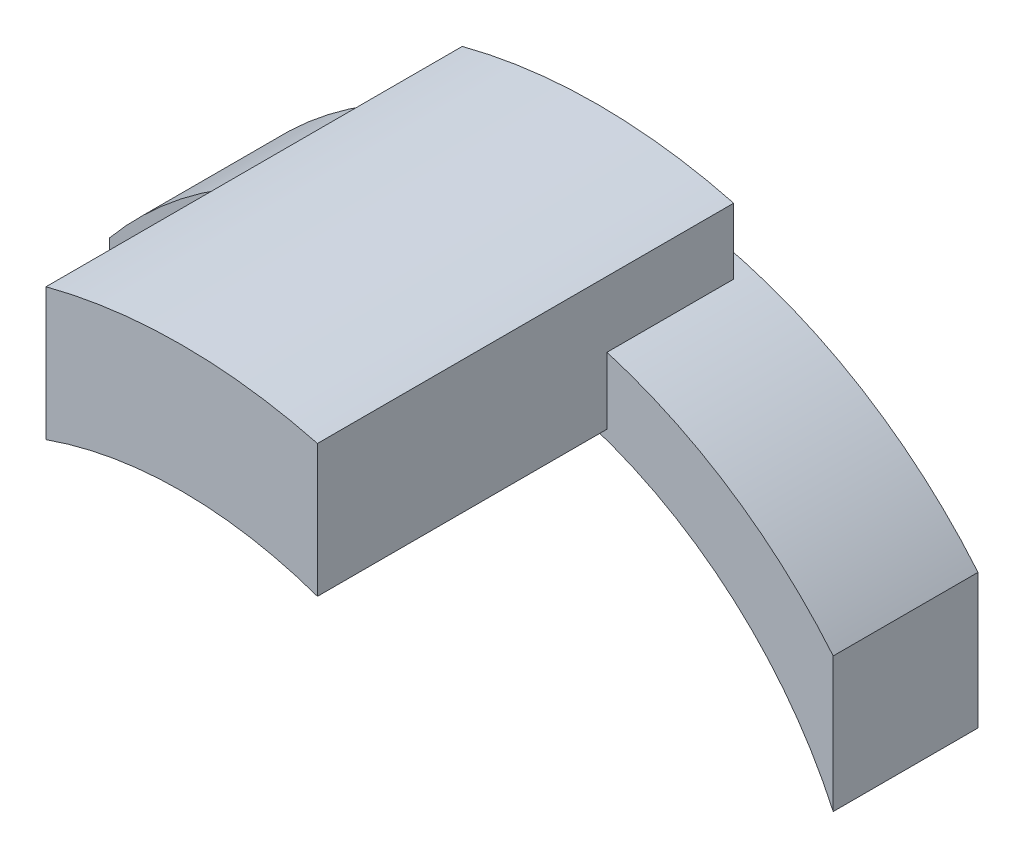
ISO-10303-21;
HEADER;
FILE_DESCRIPTION(('STEP AP214'),'2;1');
FILE_NAME('part.step','',(''),(''),'','','');
FILE_SCHEMA(('AUTOMOTIVE_DESIGN { 1 0 10303 214 1 1 1 1 }'));
ENDSEC;
DATA;
#1=APPLICATION_CONTEXT('core data for automotive mechanical design processes');
#2=APPLICATION_PROTOCOL_DEFINITION('international standard','automotive_design',2000,#1);
#3=PRODUCT_CONTEXT('',#1,'mechanical');
#4=PRODUCT('Part','Part','',(#3));
#5=PRODUCT_RELATED_PRODUCT_CATEGORY('part','',(#4));
#6=PRODUCT_DEFINITION_FORMATION('','',#4);
#7=PRODUCT_DEFINITION_CONTEXT('part definition',#1,'design');
#8=PRODUCT_DEFINITION('design','',#6,#7);
#9=PRODUCT_DEFINITION_SHAPE('','',#8);
#10=(LENGTH_UNIT() NAMED_UNIT(*) SI_UNIT(.MILLI.,.METRE.));
#11=(NAMED_UNIT(*) PLANE_ANGLE_UNIT() SI_UNIT($,.RADIAN.));
#12=(NAMED_UNIT(*) SI_UNIT($,.STERADIAN.) SOLID_ANGLE_UNIT());
#13=UNCERTAINTY_MEASURE_WITH_UNIT(LENGTH_MEASURE(1.E-05),#10,'distance_accuracy_value','');
#14=(GEOMETRIC_REPRESENTATION_CONTEXT(3) GLOBAL_UNCERTAINTY_ASSIGNED_CONTEXT((#13)) GLOBAL_UNIT_ASSIGNED_CONTEXT((#10,
#11,#12)) REPRESENTATION_CONTEXT('',''));
#15=CARTESIAN_POINT('',(0.,0.,0.));
#16=DIRECTION('',(0.,0.,1.));
#17=DIRECTION('',(1.,0.,0.));
#18=AXIS2_PLACEMENT_3D('',#15,#16,#17);
#19=CARTESIAN_POINT('',(0.,0.,4.));
#20=DIRECTION('',(0.,0.,-1.));
#21=DIRECTION('',(-1.,0.,0.));
#22=AXIS2_PLACEMENT_3D('',#19,#20,#21);
#23=CYLINDRICAL_SURFACE('',#22,26.);
#24=DIRECTION('',(0.,0.,-1.));
#25=VECTOR('',#24,1.);
#26=CARTESIAN_POINT('',(-7.49999999999998,24.8947785690092,4.));
#27=LINE('',#26,#25);
#28=CARTESIAN_POINT('',(-7.49999999999998,24.8947785690092,-3.));
#29=VERTEX_POINT('',#28);
#30=CARTESIAN_POINT('',(-7.49999999999998,24.8947785690092,4.));
#31=VERTEX_POINT('',#30);
#32=EDGE_CURVE('E188',#29,#31,#27,.F.);
#33=ORIENTED_EDGE('',*,*,#32,.F.);
#34=CARTESIAN_POINT('',(0.,0.,-3.));
#35=DIRECTION('',(0.,0.,-1.));
#36=DIRECTION('',(-1.,0.,0.));
#37=AXIS2_PLACEMENT_3D('',#34,#35,#36);
#38=CIRCLE('',#37,26.);
#39=CARTESIAN_POINT('',(7.50000000000001,24.8947785690092,-3.));
#40=VERTEX_POINT('',#39);
#41=EDGE_CURVE('E11',#29,#40,#38,.T.);
#42=ORIENTED_EDGE('',*,*,#41,.T.);
#43=DIRECTION('',(0.,0.,-1.));
#44=VECTOR('',#43,1.);
#45=CARTESIAN_POINT('',(7.50000000000001,24.8947785690092,4.));
#46=LINE('',#45,#44);
#47=CARTESIAN_POINT('',(7.50000000000001,24.8947785690092,4.));
#48=VERTEX_POINT('',#47);
#49=EDGE_CURVE('E147',#48,#40,#46,.T.);
#50=ORIENTED_EDGE('',*,*,#49,.F.);
#51=CARTESIAN_POINT('',(0.,0.,4.));
#52=DIRECTION('',(0.,0.,1.));
#53=DIRECTION('',(1.,0.,0.));
#54=AXIS2_PLACEMENT_3D('',#51,#52,#53);
#55=CIRCLE('',#54,26.);
#56=CARTESIAN_POINT('',(20.,16.6132477258361,4.));
#57=VERTEX_POINT('',#56);
#58=EDGE_CURVE('E198',#57,#48,#55,.T.);
#59=ORIENTED_EDGE('',*,*,#58,.F.);
#60=DIRECTION('',(0.,0.,-1.));
#61=VECTOR('',#60,1.);
#62=CARTESIAN_POINT('',(20.,16.6132477258361,4.));
#63=LINE('',#62,#61);
#64=CARTESIAN_POINT('',(20.,16.6132477258361,-4.));
#65=VERTEX_POINT('',#64);
#66=EDGE_CURVE('E221',#57,#65,#63,.T.);
#67=ORIENTED_EDGE('',*,*,#66,.T.);
#68=CARTESIAN_POINT('',(0.,0.,-4.));
#69=DIRECTION('',(0.,0.,1.));
#70=DIRECTION('',(1.,0.,0.));
#71=AXIS2_PLACEMENT_3D('',#68,#69,#70);
#72=CIRCLE('',#71,26.);
#73=CARTESIAN_POINT('',(-20.,16.6132477258361,-4.));
#74=VERTEX_POINT('',#73);
#75=EDGE_CURVE('E211',#65,#74,#72,.T.);
#76=ORIENTED_EDGE('',*,*,#75,.T.);
#77=DIRECTION('',(0.,0.,-1.));
#78=VECTOR('',#77,1.);
#79=CARTESIAN_POINT('',(-20.,16.6132477258361,4.));
#80=LINE('',#79,#78);
#81=CARTESIAN_POINT('',(-20.,16.6132477258361,4.));
#82=VERTEX_POINT('',#81);
#83=EDGE_CURVE('E218',#82,#74,#80,.T.);
#84=ORIENTED_EDGE('',*,*,#83,.F.);
#85=EDGE_CURVE('E197',#31,#82,#55,.T.);
#86=ORIENTED_EDGE('',*,*,#85,.F.);
#87=EDGE_LOOP('',(#33,#42,#50,#59,#67,#76,#84,#86));
#88=FACE_BOUND('',#87,.T.);
#89=ADVANCED_FACE('F47',(#88),#23,.T.);
#90=CARTESIAN_POINT('',(0.,0.,4.));
#91=DIRECTION('',(0.,0.,1.));
#92=DIRECTION('',(1.,0.,0.));
#93=AXIS2_PLACEMENT_3D('',#90,#91,#92);
#94=PLANE('',#93);
#95=CARTESIAN_POINT('',(0.,0.,4.));
#96=DIRECTION('',(0.,0.,1.));
#97=DIRECTION('',(1.,0.,0.));
#98=AXIS2_PLACEMENT_3D('',#95,#96,#97);
#99=CIRCLE('',#98,22.5);
#100=CARTESIAN_POINT('',(7.50000000000001,21.2132034355964,4.));
#101=VERTEX_POINT('',#100);
#102=CARTESIAN_POINT('',(-7.49999999999998,21.2132034355964,4.));
#103=VERTEX_POINT('',#102);
#104=EDGE_CURVE('E232',#101,#103,#99,.T.);
#105=ORIENTED_EDGE('',*,*,#104,.T.);
#106=DIRECTION('',(0.,1.,0.));
#107=VECTOR('',#106,1.);
#108=CARTESIAN_POINT('',(-7.49999999999998,0.,4.));
#109=LINE('',#108,#107);
#110=EDGE_CURVE('E57',#103,#31,#109,.T.);
#111=ORIENTED_EDGE('',*,*,#110,.T.);
#112=ORIENTED_EDGE('',*,*,#85,.T.);
#113=DIRECTION('',(0.,-1.,0.));
#114=VECTOR('',#113,1.);
#115=CARTESIAN_POINT('',(-20.,9.16515138991168,4.));
#116=LINE('',#115,#114);
#117=CARTESIAN_POINT('',(-20.,9.16515138991168,4.));
#118=VERTEX_POINT('',#117);
#119=EDGE_CURVE('E73',#82,#118,#116,.T.);
#120=ORIENTED_EDGE('',*,*,#119,.T.);
#121=CARTESIAN_POINT('',(0.,0.,4.));
#122=DIRECTION('',(0.,0.,-1.));
#123=DIRECTION('',(1.,0.,0.));
#124=AXIS2_PLACEMENT_3D('',#121,#122,#123);
#125=CIRCLE('',#124,22.);
#126=CARTESIAN_POINT('',(20.,9.16515138991168,4.));
#127=VERTEX_POINT('',#126);
#128=EDGE_CURVE('E192',#118,#127,#125,.T.);
#129=ORIENTED_EDGE('',*,*,#128,.T.);
#130=DIRECTION('',(0.,1.,0.));
#131=VECTOR('',#130,1.);
#132=CARTESIAN_POINT('',(20.,16.6132477258361,4.));
#133=LINE('',#132,#131);
#134=EDGE_CURVE('E102',#127,#57,#133,.T.);
#135=ORIENTED_EDGE('',*,*,#134,.T.);
#136=ORIENTED_EDGE('',*,*,#58,.T.);
#137=DIRECTION('',(0.,-1.,0.));
#138=VECTOR('',#137,1.);
#139=CARTESIAN_POINT('',(7.50000000000001,0.,4.));
#140=LINE('',#139,#138);
#141=EDGE_CURVE('E228',#48,#101,#140,.T.);
#142=ORIENTED_EDGE('',*,*,#141,.T.);
#143=EDGE_LOOP('',(#105,#111,#112,#120,#129,#135,#136,#142));
#144=FACE_BOUND('',#143,.T.);
#145=ADVANCED_FACE('F236',(#144),#94,.T.);
#146=CARTESIAN_POINT('',(0.,0.,4.));
#147=DIRECTION('',(0.,0.,-1.));
#148=DIRECTION('',(-1.,0.,0.));
#149=AXIS2_PLACEMENT_3D('',#146,#147,#148);
#150=CYLINDRICAL_SURFACE('',#149,22.);
#151=CARTESIAN_POINT('',(0.,0.,-4.));
#152=DIRECTION('',(0.,0.,-1.));
#153=DIRECTION('',(1.,0.,0.));
#154=AXIS2_PLACEMENT_3D('',#151,#152,#153);
#155=CIRCLE('',#154,22.);
#156=CARTESIAN_POINT('',(-20.,9.16515138991168,-4.));
#157=VERTEX_POINT('',#156);
#158=CARTESIAN_POINT('',(20.,9.16515138991168,-4.));
#159=VERTEX_POINT('',#158);
#160=EDGE_CURVE('E191',#157,#159,#155,.T.);
#161=ORIENTED_EDGE('',*,*,#160,.T.);
#162=DIRECTION('',(0.,0.,-1.));
#163=VECTOR('',#162,1.);
#164=CARTESIAN_POINT('',(20.,9.16515138991168,4.));
#165=LINE('',#164,#163);
#166=EDGE_CURVE('E225',#127,#159,#165,.T.);
#167=ORIENTED_EDGE('',*,*,#166,.F.);
#168=ORIENTED_EDGE('',*,*,#128,.F.);
#169=DIRECTION('',(0.,0.,-1.));
#170=VECTOR('',#169,1.);
#171=CARTESIAN_POINT('',(-20.,9.16515138991168,4.));
#172=LINE('',#171,#170);
#173=EDGE_CURVE('E204',#118,#157,#172,.T.);
#174=ORIENTED_EDGE('',*,*,#173,.T.);
#175=EDGE_LOOP('',(#161,#167,#168,#174));
#176=FACE_BOUND('',#175,.T.);
#177=ADVANCED_FACE('F50',(#176),#150,.F.);
#178=CARTESIAN_POINT('',(20.,16.6132477258361,4.));
#179=DIRECTION('',(-1.,0.,0.));
#180=DIRECTION('',(0.,-1.,0.));
#181=AXIS2_PLACEMENT_3D('',#178,#179,#180);
#182=PLANE('',#181);
#183=DIRECTION('',(0.,1.,0.));
#184=VECTOR('',#183,1.);
#185=CARTESIAN_POINT('',(20.,16.6132477258361,-4.));
#186=LINE('',#185,#184);
#187=EDGE_CURVE('E208',#159,#65,#186,.T.);
#188=ORIENTED_EDGE('',*,*,#187,.T.);
#189=ORIENTED_EDGE('',*,*,#66,.F.);
#190=ORIENTED_EDGE('',*,*,#134,.F.);
#191=ORIENTED_EDGE('',*,*,#166,.T.);
#192=EDGE_LOOP('',(#188,#189,#190,#191));
#193=FACE_BOUND('',#192,.T.);
#194=ADVANCED_FACE('F248',(#193),#182,.F.);
#195=CARTESIAN_POINT('',(-20.,9.16515138991168,4.));
#196=DIRECTION('',(1.,0.,0.));
#197=DIRECTION('',(0.,1.,0.));
#198=AXIS2_PLACEMENT_3D('',#195,#196,#197);
#199=PLANE('',#198);
#200=DIRECTION('',(0.,-1.,0.));
#201=VECTOR('',#200,1.);
#202=CARTESIAN_POINT('',(-20.,9.16515138991168,-4.));
#203=LINE('',#202,#201);
#204=EDGE_CURVE('E94',#74,#157,#203,.T.);
#205=ORIENTED_EDGE('',*,*,#204,.T.);
#206=ORIENTED_EDGE('',*,*,#173,.F.);
#207=ORIENTED_EDGE('',*,*,#119,.F.);
#208=ORIENTED_EDGE('',*,*,#83,.T.);
#209=EDGE_LOOP('',(#205,#206,#207,#208));
#210=FACE_BOUND('',#209,.T.);
#211=ADVANCED_FACE('F242',(#210),#199,.F.);
#212=CARTESIAN_POINT('',(0.,0.,-4.));
#213=DIRECTION('',(0.,0.,1.));
#214=DIRECTION('',(1.,0.,0.));
#215=AXIS2_PLACEMENT_3D('',#212,#213,#214);
#216=PLANE('',#215);
#217=ORIENTED_EDGE('',*,*,#160,.F.);
#218=ORIENTED_EDGE('',*,*,#204,.F.);
#219=ORIENTED_EDGE('',*,*,#75,.F.);
#220=ORIENTED_EDGE('',*,*,#187,.F.);
#221=EDGE_LOOP('',(#217,#218,#219,#220));
#222=FACE_BOUND('',#221,.T.);
#223=ADVANCED_FACE('F286',(#222),#216,.F.);
#224=CARTESIAN_POINT('',(0.,0.,-3.));
#225=DIRECTION('',(0.,0.,-1.));
#226=DIRECTION('',(-1.,0.,0.));
#227=AXIS2_PLACEMENT_3D('',#224,#225,#226);
#228=PLANE('',#227);
#229=ORIENTED_EDGE('',*,*,#41,.F.);
#230=DIRECTION('',(0.,1.,0.));
#231=VECTOR('',#230,1.);
#232=CARTESIAN_POINT('',(-7.49999999999998,21.2132034355964,-3.));
#233=LINE('',#232,#231);
#234=CARTESIAN_POINT('',(-7.49999999999999,28.5306852353742,-3.));
#235=VERTEX_POINT('',#234);
#236=EDGE_CURVE('E169',#29,#235,#233,.T.);
#237=ORIENTED_EDGE('',*,*,#236,.T.);
#238=CARTESIAN_POINT('',(0.,0.,-3.));
#239=DIRECTION('',(0.,0.,-1.));
#240=DIRECTION('',(-1.,0.,0.));
#241=AXIS2_PLACEMENT_3D('',#238,#239,#240);
#242=CIRCLE('',#241,29.5);
#243=CARTESIAN_POINT('',(7.50000000000001,28.5306852353742,-3.));
#244=VERTEX_POINT('',#243);
#245=EDGE_CURVE('E172',#235,#244,#242,.T.);
#246=ORIENTED_EDGE('',*,*,#245,.T.);
#247=DIRECTION('',(0.,-1.,0.));
#248=VECTOR('',#247,1.);
#249=CARTESIAN_POINT('',(7.50000000000001,28.5306852353742,-3.));
#250=LINE('',#249,#248);
#251=EDGE_CURVE('E175',#244,#40,#250,.T.);
#252=ORIENTED_EDGE('',*,*,#251,.T.);
#253=EDGE_LOOP('',(#229,#237,#246,#252));
#254=FACE_BOUND('',#253,.T.);
#255=ADVANCED_FACE('F253',(#254),#228,.T.);
#256=CARTESIAN_POINT('',(-7.49999999999998,21.2132034355964,-3.));
#257=DIRECTION('',(1.,0.,0.));
#258=DIRECTION('',(0.,0.,-1.));
#259=AXIS2_PLACEMENT_3D('',#256,#257,#258);
#260=PLANE('',#259);
#261=ORIENTED_EDGE('',*,*,#236,.F.);
#262=ORIENTED_EDGE('',*,*,#32,.T.);
#263=ORIENTED_EDGE('',*,*,#110,.F.);
#264=DIRECTION('',(0.,0.,1.));
#265=VECTOR('',#264,1.);
#266=CARTESIAN_POINT('',(-7.49999999999998,21.2132034355964,-3.));
#267=LINE('',#266,#265);
#268=CARTESIAN_POINT('',(-7.49999999999998,21.2132034355964,20.));
#269=VERTEX_POINT('',#268);
#270=EDGE_CURVE('E136',#103,#269,#267,.T.);
#271=ORIENTED_EDGE('',*,*,#270,.T.);
#272=DIRECTION('',(0.,1.,0.));
#273=VECTOR('',#272,1.);
#274=CARTESIAN_POINT('',(-7.49999999999998,21.2132034355964,20.));
#275=LINE('',#274,#273);
#276=CARTESIAN_POINT('',(-7.49999999999999,28.5306852353742,20.));
#277=VERTEX_POINT('',#276);
#278=EDGE_CURVE('E141',#269,#277,#275,.T.);
#279=ORIENTED_EDGE('',*,*,#278,.T.);
#280=DIRECTION('',(0.,0.,1.));
#281=VECTOR('',#280,1.);
#282=CARTESIAN_POINT('',(-7.49999999999999,28.5306852353742,-3.));
#283=LINE('',#282,#281);
#284=EDGE_CURVE('E148',#235,#277,#283,.T.);
#285=ORIENTED_EDGE('',*,*,#284,.F.);
#286=EDGE_LOOP('',(#261,#262,#263,#271,#279,#285));
#287=FACE_BOUND('',#286,.T.);
#288=ADVANCED_FACE('F139',(#287),#260,.F.);
#289=CARTESIAN_POINT('',(7.50000000000001,28.5306852353742,-3.));
#290=DIRECTION('',(-1.,0.,0.));
#291=DIRECTION('',(0.,0.,1.));
#292=AXIS2_PLACEMENT_3D('',#289,#290,#291);
#293=PLANE('',#292);
#294=ORIENTED_EDGE('',*,*,#141,.F.);
#295=ORIENTED_EDGE('',*,*,#49,.T.);
#296=ORIENTED_EDGE('',*,*,#251,.F.);
#297=DIRECTION('',(0.,0.,1.));
#298=VECTOR('',#297,1.);
#299=CARTESIAN_POINT('',(7.50000000000001,28.5306852353742,-3.));
#300=LINE('',#299,#298);
#301=CARTESIAN_POINT('',(7.50000000000001,28.5306852353742,20.));
#302=VERTEX_POINT('',#301);
#303=EDGE_CURVE('E181',#244,#302,#300,.T.);
#304=ORIENTED_EDGE('',*,*,#303,.T.);
#305=DIRECTION('',(0.,-1.,0.));
#306=VECTOR('',#305,1.);
#307=CARTESIAN_POINT('',(7.50000000000001,28.5306852353742,20.));
#308=LINE('',#307,#306);
#309=CARTESIAN_POINT('',(7.50000000000001,21.2132034355964,20.));
#310=VERTEX_POINT('',#309);
#311=EDGE_CURVE('E166',#302,#310,#308,.T.);
#312=ORIENTED_EDGE('',*,*,#311,.T.);
#313=DIRECTION('',(0.,0.,1.));
#314=VECTOR('',#313,1.);
#315=CARTESIAN_POINT('',(7.50000000000001,21.2132034355964,-3.));
#316=LINE('',#315,#314);
#317=EDGE_CURVE('E64',#101,#310,#316,.T.);
#318=ORIENTED_EDGE('',*,*,#317,.F.);
#319=EDGE_LOOP('',(#294,#295,#296,#304,#312,#318));
#320=FACE_BOUND('',#319,.T.);
#321=ADVANCED_FACE('F251',(#320),#293,.F.);
#322=CARTESIAN_POINT('',(0.,0.,-3.));
#323=DIRECTION('',(0.,0.,1.));
#324=DIRECTION('',(1.,0.,0.));
#325=AXIS2_PLACEMENT_3D('',#322,#323,#324);
#326=CYLINDRICAL_SURFACE('',#325,22.5);
#327=ORIENTED_EDGE('',*,*,#104,.F.);
#328=ORIENTED_EDGE('',*,*,#317,.T.);
#329=CARTESIAN_POINT('',(0.,0.,20.));
#330=DIRECTION('',(0.,0.,1.));
#331=DIRECTION('',(-1.,0.,0.));
#332=AXIS2_PLACEMENT_3D('',#329,#330,#331);
#333=CIRCLE('',#332,22.5);
#334=EDGE_CURVE('E155',#310,#269,#333,.T.);
#335=ORIENTED_EDGE('',*,*,#334,.T.);
#336=ORIENTED_EDGE('',*,*,#270,.F.);
#337=EDGE_LOOP('',(#327,#328,#335,#336));
#338=FACE_BOUND('',#337,.T.);
#339=ADVANCED_FACE('F160',(#338),#326,.F.);
#340=CARTESIAN_POINT('',(0.,0.,-3.));
#341=DIRECTION('',(0.,0.,1.));
#342=DIRECTION('',(1.,0.,0.));
#343=AXIS2_PLACEMENT_3D('',#340,#341,#342);
#344=CYLINDRICAL_SURFACE('',#343,29.5);
#345=ORIENTED_EDGE('',*,*,#284,.T.);
#346=CARTESIAN_POINT('',(0.,0.,20.));
#347=DIRECTION('',(0.,0.,-1.));
#348=DIRECTION('',(-1.,0.,0.));
#349=AXIS2_PLACEMENT_3D('',#346,#347,#348);
#350=CIRCLE('',#349,29.5);
#351=EDGE_CURVE('E157',#277,#302,#350,.T.);
#352=ORIENTED_EDGE('',*,*,#351,.T.);
#353=ORIENTED_EDGE('',*,*,#303,.F.);
#354=ORIENTED_EDGE('',*,*,#245,.F.);
#355=EDGE_LOOP('',(#345,#352,#353,#354));
#356=FACE_BOUND('',#355,.T.);
#357=ADVANCED_FACE('F257',(#356),#344,.T.);
#358=CARTESIAN_POINT('',(0.,0.,20.));
#359=DIRECTION('',(0.,0.,-1.));
#360=DIRECTION('',(-1.,0.,0.));
#361=AXIS2_PLACEMENT_3D('',#358,#359,#360);
#362=PLANE('',#361);
#363=ORIENTED_EDGE('',*,*,#334,.F.);
#364=ORIENTED_EDGE('',*,*,#311,.F.);
#365=ORIENTED_EDGE('',*,*,#351,.F.);
#366=ORIENTED_EDGE('',*,*,#278,.F.);
#367=EDGE_LOOP('',(#363,#364,#365,#366));
#368=FACE_BOUND('',#367,.T.);
#369=ADVANCED_FACE('F153',(#368),#362,.F.);
#370=CLOSED_SHELL('',(#89,#145,#177,#194,#211,#223,#255,#288,#321,#339,#357,#369));
#371=MANIFOLD_SOLID_BREP('B2',#370);
#372=ADVANCED_BREP_SHAPE_REPRESENTATION('',(#18,#371),#14);
#373=SHAPE_DEFINITION_REPRESENTATION(#9,#372);
ENDSEC;
END-ISO-10303-21;
